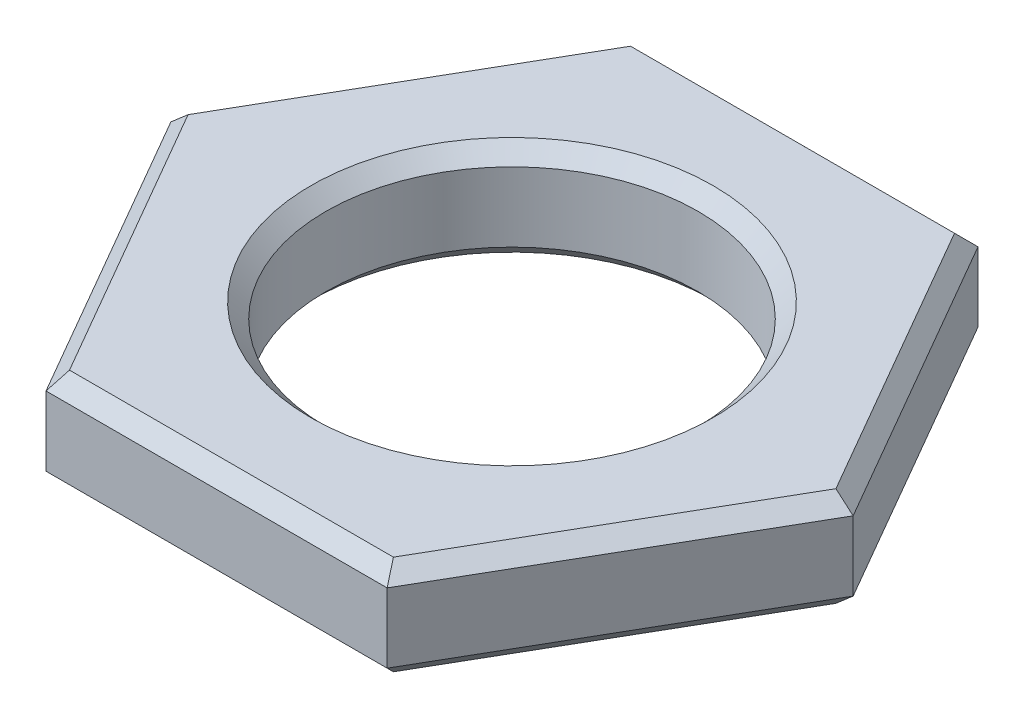
ISO-10303-21;
HEADER;
FILE_DESCRIPTION(('STEP AP214'),'2;1');
FILE_NAME('part.step','',(''),(''),'','','');
FILE_SCHEMA(('AUTOMOTIVE_DESIGN { 1 0 10303 214 1 1 1 1 }'));
ENDSEC;
DATA;
#1=APPLICATION_CONTEXT('core data for automotive mechanical design processes');
#2=APPLICATION_PROTOCOL_DEFINITION('international standard','automotive_design',2000,#1);
#3=PRODUCT_CONTEXT('',#1,'mechanical');
#4=PRODUCT('Part','Part','',(#3));
#5=PRODUCT_RELATED_PRODUCT_CATEGORY('part','',(#4));
#6=PRODUCT_DEFINITION_FORMATION('','',#4);
#7=PRODUCT_DEFINITION_CONTEXT('part definition',#1,'design');
#8=PRODUCT_DEFINITION('design','',#6,#7);
#9=PRODUCT_DEFINITION_SHAPE('','',#8);
#10=(LENGTH_UNIT() NAMED_UNIT(*) SI_UNIT(.MILLI.,.METRE.));
#11=(NAMED_UNIT(*) PLANE_ANGLE_UNIT() SI_UNIT($,.RADIAN.));
#12=(NAMED_UNIT(*) SI_UNIT($,.STERADIAN.) SOLID_ANGLE_UNIT());
#13=UNCERTAINTY_MEASURE_WITH_UNIT(LENGTH_MEASURE(1.E-05),#10,'distance_accuracy_value','');
#14=(GEOMETRIC_REPRESENTATION_CONTEXT(3) GLOBAL_UNCERTAINTY_ASSIGNED_CONTEXT((#13)) GLOBAL_UNIT_ASSIGNED_CONTEXT((#10,
#11,#12)) REPRESENTATION_CONTEXT('',''));
#15=CARTESIAN_POINT('',(0.,0.,0.));
#16=DIRECTION('',(0.,0.,1.));
#17=DIRECTION('',(1.,0.,0.));
#18=AXIS2_PLACEMENT_3D('',#15,#16,#17);
#19=CARTESIAN_POINT('',(0.,0.,0.));
#20=DIRECTION('',(0.,1.,0.));
#21=DIRECTION('',(0.,0.,1.));
#22=AXIS2_PLACEMENT_3D('',#19,#20,#21);
#23=PLANE('',#22);
#24=DIRECTION('',(0.499999999999999,0.,-0.866025403784439));
#25=VECTOR('',#24,1.);
#26=CARTESIAN_POINT('',(-6.52405804184277,0.,0.));
#27=LINE('',#26,#25);
#28=CARTESIAN_POINT('',(-6.52405804184277,0.,0.));
#29=VERTEX_POINT('',#28);
#30=CARTESIAN_POINT('',(-3.26202902092139,0.,-5.65));
#31=VERTEX_POINT('',#30);
#32=EDGE_CURVE('E221',#29,#31,#27,.T.);
#33=ORIENTED_EDGE('',*,*,#32,.T.);
#34=DIRECTION('',(1.,0.,0.));
#35=VECTOR('',#34,1.);
#36=CARTESIAN_POINT('',(3.43523410167827,0.,-5.65));
#37=LINE('',#36,#35);
#38=CARTESIAN_POINT('',(3.26202902092139,0.,-5.65));
#39=VERTEX_POINT('',#38);
#40=EDGE_CURVE('E104',#31,#39,#37,.T.);
#41=ORIENTED_EDGE('',*,*,#40,.T.);
#42=DIRECTION('',(0.5,0.,0.866025403784439));
#43=VECTOR('',#42,1.);
#44=CARTESIAN_POINT('',(3.26202902092139,0.,-5.65));
#45=LINE('',#44,#43);
#46=CARTESIAN_POINT('',(6.52405804184277,0.,0.));
#47=VERTEX_POINT('',#46);
#48=EDGE_CURVE('E106',#39,#47,#45,.T.);
#49=ORIENTED_EDGE('',*,*,#48,.T.);
#50=DIRECTION('',(-0.5,0.,0.866025403784439));
#51=VECTOR('',#50,1.);
#52=CARTESIAN_POINT('',(6.52405804184277,0.,0.));
#53=LINE('',#52,#51);
#54=CARTESIAN_POINT('',(3.26202902092139,0.,5.65));
#55=VERTEX_POINT('',#54);
#56=EDGE_CURVE('E109',#47,#55,#53,.T.);
#57=ORIENTED_EDGE('',*,*,#56,.T.);
#58=DIRECTION('',(1.,0.,0.));
#59=VECTOR('',#58,1.);
#60=CARTESIAN_POINT('',(-3.43523410167827,0.,5.65));
#61=LINE('',#60,#59);
#62=CARTESIAN_POINT('',(-3.26202902092138,0.,5.65));
#63=VERTEX_POINT('',#62);
#64=EDGE_CURVE('E213',#55,#63,#61,.F.);
#65=ORIENTED_EDGE('',*,*,#64,.T.);
#66=DIRECTION('',(-0.5,0.,-0.866025403784439));
#67=VECTOR('',#66,1.);
#68=CARTESIAN_POINT('',(-3.26202902092138,0.,5.65));
#69=LINE('',#68,#67);
#70=EDGE_CURVE('E217',#63,#29,#69,.T.);
#71=ORIENTED_EDGE('',*,*,#70,.T.);
#72=EDGE_LOOP('',(#33,#41,#49,#57,#65,#71));
#73=FACE_BOUND('',#72,.T.);
#74=CARTESIAN_POINT('',(0.,0.,0.));
#75=DIRECTION('',(0.,-1.,0.));
#76=DIRECTION('',(0.,0.,-1.));
#77=AXIS2_PLACEMENT_3D('',#74,#75,#76);
#78=CIRCLE('',#77,4.05000000000655);
#79=CARTESIAN_POINT('',(0.,0.,-4.05000000000655));
#80=VERTEX_POINT('',#79);
#81=EDGE_CURVE('E20',#80,#80,#78,.F.);
#82=ORIENTED_EDGE('',*,*,#81,.T.);
#83=EDGE_LOOP('',(#82));
#84=FACE_BOUND('',#83,.T.);
#85=ADVANCED_FACE('F17',(#73,#84),#23,.F.);
#86=CARTESIAN_POINT('',(0.,1.13686837721616E-10,0.));
#87=DIRECTION('',(0.,-1.,0.));
#88=DIRECTION('',(0.,0.,-1.));
#89=AXIS2_PLACEMENT_3D('',#86,#87,#88);
#90=CONICAL_SURFACE('',#89,4.04999999989286,0.785398163397448);
#91=CARTESIAN_POINT('',(0.,0.300000000000004,0.));
#92=DIRECTION('',(0.,-1.,0.));
#93=DIRECTION('',(0.,0.,-1.));
#94=AXIS2_PLACEMENT_3D('',#91,#92,#93);
#95=CIRCLE('',#94,3.75);
#96=CARTESIAN_POINT('',(0.,0.300000000000004,-3.75));
#97=VERTEX_POINT('',#96);
#98=EDGE_CURVE('E132',#97,#97,#95,.F.);
#99=ORIENTED_EDGE('',*,*,#98,.T.);
#100=EDGE_LOOP('',(#99));
#101=FACE_BOUND('',#100,.T.);
#102=ORIENTED_EDGE('',*,*,#81,.F.);
#103=EDGE_LOOP('',(#102));
#104=FACE_BOUND('',#103,.T.);
#105=ADVANCED_FACE('F456',(#101,#104),#90,.F.);
#106=CARTESIAN_POINT('',(3.43523410167827,0.299999999999996,5.95));
#107=DIRECTION('',(-0.612372435695792,0.70710678118655,-0.353553390593272));
#108=DIRECTION('',(-0.755928946018457,-0.654653670707974,0.));
#109=AXIS2_PLACEMENT_3D('',#106,#107,#108);
#110=PLANE('',#109);
#111=ORIENTED_EDGE('',*,*,#56,.F.);
#112=DIRECTION('',(-0.755928946018459,-0.654653670707972,0.));
#113=VECTOR('',#112,1.);
#114=CARTESIAN_POINT('',(6.87046820335655,0.299999999999996,0.));
#115=LINE('',#114,#113);
#116=CARTESIAN_POINT('',(6.87046820335655,0.299999999999996,0.));
#117=VERTEX_POINT('',#116);
#118=EDGE_CURVE('E114',#47,#117,#115,.F.);
#119=ORIENTED_EDGE('',*,*,#118,.T.);
#120=DIRECTION('',(-0.5,0.,0.866025403784439));
#121=VECTOR('',#120,1.);
#122=CARTESIAN_POINT('',(3.43523410167827,0.299999999999996,5.95));
#123=LINE('',#122,#121);
#124=CARTESIAN_POINT('',(3.43523410167827,0.299999999999996,5.95));
#125=VERTEX_POINT('',#124);
#126=EDGE_CURVE('E134',#117,#125,#123,.T.);
#127=ORIENTED_EDGE('',*,*,#126,.T.);
#128=DIRECTION('',(-0.377964473009227,-0.654653670707974,-0.654653670707981));
#129=VECTOR('',#128,1.);
#130=CARTESIAN_POINT('',(3.43523410167828,0.299999999999996,5.95));
#131=LINE('',#130,#129);
#132=EDGE_CURVE('E120',#125,#55,#131,.T.);
#133=ORIENTED_EDGE('',*,*,#132,.T.);
#134=EDGE_LOOP('',(#111,#119,#127,#133));
#135=FACE_BOUND('',#134,.T.);
#136=ADVANCED_FACE('F117',(#135),#110,.F.);
#137=CARTESIAN_POINT('',(6.87046820335655,0.299999999999996,0.));
#138=DIRECTION('',(-0.612372435695791,0.707106781186552,0.353553390593272));
#139=DIRECTION('',(-0.755928946018459,-0.654653670707972,0.));
#140=AXIS2_PLACEMENT_3D('',#137,#138,#139);
#141=PLANE('',#140);
#142=ORIENTED_EDGE('',*,*,#48,.F.);
#143=DIRECTION('',(0.377964473009229,0.654653670707973,-0.65465367070798));
#144=VECTOR('',#143,1.);
#145=CARTESIAN_POINT('',(3.26202902092139,0.,-5.65));
#146=LINE('',#145,#144);
#147=CARTESIAN_POINT('',(3.43523410167827,0.299999999999997,-5.95));
#148=VERTEX_POINT('',#147);
#149=EDGE_CURVE('E128',#39,#148,#146,.T.);
#150=ORIENTED_EDGE('',*,*,#149,.T.);
#151=DIRECTION('',(0.5,0.,0.866025403784439));
#152=VECTOR('',#151,1.);
#153=CARTESIAN_POINT('',(6.87046820335655,0.299999999999996,0.));
#154=LINE('',#153,#152);
#155=EDGE_CURVE('E125',#148,#117,#154,.T.);
#156=ORIENTED_EDGE('',*,*,#155,.T.);
#157=ORIENTED_EDGE('',*,*,#118,.F.);
#158=EDGE_LOOP('',(#142,#150,#156,#157));
#159=FACE_BOUND('',#158,.T.);
#160=ADVANCED_FACE('F123',(#159),#141,.F.);
#161=CARTESIAN_POINT('',(3.43523410167827,0.299999999999996,-5.95));
#162=DIRECTION('',(0.,0.707106781186551,0.707106781186544));
#163=DIRECTION('',(0.,-0.707106781186544,0.707106781186551));
#164=AXIS2_PLACEMENT_3D('',#161,#162,#163);
#165=PLANE('',#164);
#166=ORIENTED_EDGE('',*,*,#40,.F.);
#167=DIRECTION('',(-0.377964473009229,0.654653670707973,-0.65465367070798));
#168=VECTOR('',#167,1.);
#169=CARTESIAN_POINT('',(-3.26202902092139,0.,-5.65));
#170=LINE('',#169,#168);
#171=CARTESIAN_POINT('',(-3.43523410167828,0.299999999999997,-5.95));
#172=VERTEX_POINT('',#171);
#173=EDGE_CURVE('E219',#31,#172,#170,.T.);
#174=ORIENTED_EDGE('',*,*,#173,.T.);
#175=DIRECTION('',(1.,0.,0.));
#176=VECTOR('',#175,1.);
#177=CARTESIAN_POINT('',(3.43523410167827,0.299999999999996,-5.95));
#178=LINE('',#177,#176);
#179=EDGE_CURVE('E201',#172,#148,#178,.T.);
#180=ORIENTED_EDGE('',*,*,#179,.T.);
#181=ORIENTED_EDGE('',*,*,#149,.F.);
#182=EDGE_LOOP('',(#166,#174,#180,#181));
#183=FACE_BOUND('',#182,.T.);
#184=ADVANCED_FACE('F224',(#183),#165,.F.);
#185=CARTESIAN_POINT('',(-3.43523410167828,0.299999999999996,-5.95));
#186=DIRECTION('',(0.612372435695791,0.707106781186552,0.353553390593271));
#187=DIRECTION('',(-0.755928946018458,0.654653670707973,0.));
#188=AXIS2_PLACEMENT_3D('',#185,#186,#187);
#189=PLANE('',#188);
#190=ORIENTED_EDGE('',*,*,#32,.F.);
#191=DIRECTION('',(-0.755928946018459,0.654653670707972,0.));
#192=VECTOR('',#191,1.);
#193=CARTESIAN_POINT('',(-6.87046820335655,0.299999999999997,0.));
#194=LINE('',#193,#192);
#195=CARTESIAN_POINT('',(-6.87046820335655,0.299999999999997,0.));
#196=VERTEX_POINT('',#195);
#197=EDGE_CURVE('E215',#29,#196,#194,.T.);
#198=ORIENTED_EDGE('',*,*,#197,.T.);
#199=DIRECTION('',(0.499999999999999,0.,-0.866025403784439));
#200=VECTOR('',#199,1.);
#201=CARTESIAN_POINT('',(-3.43523410167828,0.299999999999997,-5.95));
#202=LINE('',#201,#200);
#203=EDGE_CURVE('E196',#196,#172,#202,.T.);
#204=ORIENTED_EDGE('',*,*,#203,.T.);
#205=ORIENTED_EDGE('',*,*,#173,.F.);
#206=EDGE_LOOP('',(#190,#198,#204,#205));
#207=FACE_BOUND('',#206,.T.);
#208=ADVANCED_FACE('F272',(#207),#189,.F.);
#209=CARTESIAN_POINT('',(-6.87046820335655,0.299999999999996,0.));
#210=DIRECTION('',(0.612372435695791,0.707106781186552,-0.353553390593272));
#211=DIRECTION('',(-0.755928946018459,0.654653670707972,0.));
#212=AXIS2_PLACEMENT_3D('',#209,#210,#211);
#213=PLANE('',#212);
#214=DIRECTION('',(-0.5,0.,-0.866025403784438));
#215=VECTOR('',#214,1.);
#216=CARTESIAN_POINT('',(-6.87046820335655,0.299999999999996,0.));
#217=LINE('',#216,#215);
#218=CARTESIAN_POINT('',(-3.43523410167827,0.299999999999996,5.95));
#219=VERTEX_POINT('',#218);
#220=EDGE_CURVE('E191',#219,#196,#217,.T.);
#221=ORIENTED_EDGE('',*,*,#220,.T.);
#222=ORIENTED_EDGE('',*,*,#197,.F.);
#223=ORIENTED_EDGE('',*,*,#70,.F.);
#224=DIRECTION('',(-0.377964473009228,0.654653670707973,0.654653670707981));
#225=VECTOR('',#224,1.);
#226=CARTESIAN_POINT('',(-3.26202902092138,0.,5.65));
#227=LINE('',#226,#225);
#228=EDGE_CURVE('E211',#63,#219,#227,.T.);
#229=ORIENTED_EDGE('',*,*,#228,.T.);
#230=EDGE_LOOP('',(#221,#222,#223,#229));
#231=FACE_BOUND('',#230,.T.);
#232=ADVANCED_FACE('F266',(#231),#213,.F.);
#233=CARTESIAN_POINT('',(-3.43523410167827,0.299999999999996,5.95));
#234=DIRECTION('',(0.,0.707106781186552,-0.707106781186544));
#235=DIRECTION('',(0.,0.707106781186544,0.707106781186552));
#236=AXIS2_PLACEMENT_3D('',#233,#234,#235);
#237=PLANE('',#236);
#238=DIRECTION('',(-1.,0.,0.));
#239=VECTOR('',#238,1.);
#240=CARTESIAN_POINT('',(-3.43523410167827,0.299999999999996,5.95));
#241=LINE('',#240,#239);
#242=EDGE_CURVE('E183',#125,#219,#241,.T.);
#243=ORIENTED_EDGE('',*,*,#242,.T.);
#244=ORIENTED_EDGE('',*,*,#228,.F.);
#245=ORIENTED_EDGE('',*,*,#64,.F.);
#246=ORIENTED_EDGE('',*,*,#132,.F.);
#247=EDGE_LOOP('',(#243,#244,#245,#246));
#248=FACE_BOUND('',#247,.T.);
#249=ADVANCED_FACE('F258',(#248),#237,.F.);
#250=CARTESIAN_POINT('',(0.,2.,0.));
#251=DIRECTION('',(0.,-1.,0.));
#252=DIRECTION('',(0.,0.,-1.));
#253=AXIS2_PLACEMENT_3D('',#250,#251,#252);
#254=CYLINDRICAL_SURFACE('',#253,3.75);
#255=CARTESIAN_POINT('',(0.,1.70000000002801,0.));
#256=DIRECTION('',(0.,1.,0.));
#257=DIRECTION('',(0.,0.,1.));
#258=AXIS2_PLACEMENT_3D('',#255,#256,#257);
#259=CIRCLE('',#258,3.75000000002501);
#260=CARTESIAN_POINT('',(0.,1.70000000002801,3.75000000002501));
#261=VERTEX_POINT('',#260);
#262=EDGE_CURVE('E180',#261,#261,#259,.T.);
#263=ORIENTED_EDGE('',*,*,#262,.T.);
#264=EDGE_LOOP('',(#263));
#265=FACE_BOUND('',#264,.T.);
#266=ORIENTED_EDGE('',*,*,#98,.F.);
#267=EDGE_LOOP('',(#266));
#268=FACE_BOUND('',#267,.T.);
#269=ADVANCED_FACE('F322',(#265,#268),#254,.F.);
#270=CARTESIAN_POINT('',(3.43523410167827,2.,5.95));
#271=DIRECTION('',(-0.866025403784439,0.,-0.5));
#272=DIRECTION('',(-0.5,0.,0.866025403784439));
#273=AXIS2_PLACEMENT_3D('',#270,#271,#272);
#274=PLANE('',#273);
#275=ORIENTED_EDGE('',*,*,#126,.F.);
#276=DIRECTION('',(0.,1.,0.));
#277=VECTOR('',#276,1.);
#278=CARTESIAN_POINT('',(6.87046820335655,2.,0.));
#279=LINE('',#278,#277);
#280=CARTESIAN_POINT('',(6.87046820335655,1.7,0.));
#281=VERTEX_POINT('',#280);
#282=EDGE_CURVE('E204',#117,#281,#279,.T.);
#283=ORIENTED_EDGE('',*,*,#282,.T.);
#284=DIRECTION('',(0.5,0.,-0.866025403784439));
#285=VECTOR('',#284,1.);
#286=CARTESIAN_POINT('',(3.43523410167827,1.7,5.95));
#287=LINE('',#286,#285);
#288=CARTESIAN_POINT('',(3.43523410167827,1.7,5.95));
#289=VERTEX_POINT('',#288);
#290=EDGE_CURVE('E177',#289,#281,#287,.T.);
#291=ORIENTED_EDGE('',*,*,#290,.F.);
#292=DIRECTION('',(0.,1.,0.));
#293=VECTOR('',#292,1.);
#294=CARTESIAN_POINT('',(3.43523410167827,2.,5.95));
#295=LINE('',#294,#293);
#296=EDGE_CURVE('E186',#289,#125,#295,.F.);
#297=ORIENTED_EDGE('',*,*,#296,.T.);
#298=EDGE_LOOP('',(#275,#283,#291,#297));
#299=FACE_BOUND('',#298,.T.);
#300=ADVANCED_FACE('F249',(#299),#274,.F.);
#301=CARTESIAN_POINT('',(6.87046820335655,2.,0.));
#302=DIRECTION('',(-0.866025403784439,0.,0.5));
#303=DIRECTION('',(0.5,0.,0.866025403784439));
#304=AXIS2_PLACEMENT_3D('',#301,#302,#303);
#305=PLANE('',#304);
#306=ORIENTED_EDGE('',*,*,#155,.F.);
#307=DIRECTION('',(0.,1.,0.));
#308=VECTOR('',#307,1.);
#309=CARTESIAN_POINT('',(3.43523410167827,2.,-5.95));
#310=LINE('',#309,#308);
#311=CARTESIAN_POINT('',(3.43523410167827,1.7,-5.95));
#312=VERTEX_POINT('',#311);
#313=EDGE_CURVE('E199',#148,#312,#310,.T.);
#314=ORIENTED_EDGE('',*,*,#313,.T.);
#315=DIRECTION('',(-0.5,0.,-0.866025403784439));
#316=VECTOR('',#315,1.);
#317=CARTESIAN_POINT('',(6.87046820335655,1.7,0.));
#318=LINE('',#317,#316);
#319=EDGE_CURVE('E171',#281,#312,#318,.T.);
#320=ORIENTED_EDGE('',*,*,#319,.F.);
#321=ORIENTED_EDGE('',*,*,#282,.F.);
#322=EDGE_LOOP('',(#306,#314,#320,#321));
#323=FACE_BOUND('',#322,.T.);
#324=ADVANCED_FACE('F231',(#323),#305,.F.);
#325=CARTESIAN_POINT('',(3.43523410167827,2.,-5.95));
#326=DIRECTION('',(0.,0.,1.));
#327=DIRECTION('',(1.,0.,0.));
#328=AXIS2_PLACEMENT_3D('',#325,#326,#327);
#329=PLANE('',#328);
#330=ORIENTED_EDGE('',*,*,#179,.F.);
#331=DIRECTION('',(0.,1.,0.));
#332=VECTOR('',#331,1.);
#333=CARTESIAN_POINT('',(-3.43523410167828,2.,-5.95));
#334=LINE('',#333,#332);
#335=CARTESIAN_POINT('',(-3.43523410167828,1.7,-5.95));
#336=VERTEX_POINT('',#335);
#337=EDGE_CURVE('E194',#172,#336,#334,.T.);
#338=ORIENTED_EDGE('',*,*,#337,.T.);
#339=DIRECTION('',(1.,0.,0.));
#340=VECTOR('',#339,1.);
#341=CARTESIAN_POINT('',(0.,1.7,-5.95));
#342=LINE('',#341,#340);
#343=EDGE_CURVE('E165',#312,#336,#342,.F.);
#344=ORIENTED_EDGE('',*,*,#343,.F.);
#345=ORIENTED_EDGE('',*,*,#313,.F.);
#346=EDGE_LOOP('',(#330,#338,#344,#345));
#347=FACE_BOUND('',#346,.T.);
#348=ADVANCED_FACE('F234',(#347),#329,.F.);
#349=CARTESIAN_POINT('',(-3.43523410167828,2.,-5.95));
#350=DIRECTION('',(0.866025403784439,0.,0.499999999999999));
#351=DIRECTION('',(0.499999999999999,0.,-0.866025403784439));
#352=AXIS2_PLACEMENT_3D('',#349,#350,#351);
#353=PLANE('',#352);
#354=ORIENTED_EDGE('',*,*,#203,.F.);
#355=DIRECTION('',(0.,1.,0.));
#356=VECTOR('',#355,1.);
#357=CARTESIAN_POINT('',(-6.87046820335655,2.,0.));
#358=LINE('',#357,#356);
#359=CARTESIAN_POINT('',(-6.87046820335655,1.7,0.));
#360=VERTEX_POINT('',#359);
#361=EDGE_CURVE('E189',#196,#360,#358,.T.);
#362=ORIENTED_EDGE('',*,*,#361,.T.);
#363=DIRECTION('',(-0.5,0.,0.866025403784439));
#364=VECTOR('',#363,1.);
#365=CARTESIAN_POINT('',(-3.43523410167828,1.7,-5.95));
#366=LINE('',#365,#364);
#367=EDGE_CURVE('E159',#336,#360,#366,.T.);
#368=ORIENTED_EDGE('',*,*,#367,.F.);
#369=ORIENTED_EDGE('',*,*,#337,.F.);
#370=EDGE_LOOP('',(#354,#362,#368,#369));
#371=FACE_BOUND('',#370,.T.);
#372=ADVANCED_FACE('F269',(#371),#353,.F.);
#373=CARTESIAN_POINT('',(-6.87046820335655,2.,0.));
#374=DIRECTION('',(0.866025403784438,0.,-0.5));
#375=DIRECTION('',(-0.5,0.,-0.866025403784438));
#376=AXIS2_PLACEMENT_3D('',#373,#374,#375);
#377=PLANE('',#376);
#378=ORIENTED_EDGE('',*,*,#220,.F.);
#379=DIRECTION('',(0.,1.,0.));
#380=VECTOR('',#379,1.);
#381=CARTESIAN_POINT('',(-3.43523410167827,2.,5.95));
#382=LINE('',#381,#380);
#383=CARTESIAN_POINT('',(-3.43523410167827,1.7,5.95));
#384=VERTEX_POINT('',#383);
#385=EDGE_CURVE('E181',#219,#384,#382,.T.);
#386=ORIENTED_EDGE('',*,*,#385,.T.);
#387=DIRECTION('',(0.5,0.,0.866025403784438));
#388=VECTOR('',#387,1.);
#389=CARTESIAN_POINT('',(-6.87046820335655,1.7,0.));
#390=LINE('',#389,#388);
#391=EDGE_CURVE('E154',#360,#384,#390,.T.);
#392=ORIENTED_EDGE('',*,*,#391,.F.);
#393=ORIENTED_EDGE('',*,*,#361,.F.);
#394=EDGE_LOOP('',(#378,#386,#392,#393));
#395=FACE_BOUND('',#394,.T.);
#396=ADVANCED_FACE('F261',(#395),#377,.F.);
#397=CARTESIAN_POINT('',(-3.43523410167827,2.,5.95));
#398=DIRECTION('',(0.,0.,-1.));
#399=DIRECTION('',(-1.,0.,0.));
#400=AXIS2_PLACEMENT_3D('',#397,#398,#399);
#401=PLANE('',#400);
#402=ORIENTED_EDGE('',*,*,#242,.F.);
#403=ORIENTED_EDGE('',*,*,#296,.F.);
#404=DIRECTION('',(1.,0.,0.));
#405=VECTOR('',#404,1.);
#406=CARTESIAN_POINT('',(0.,1.7,5.95));
#407=LINE('',#406,#405);
#408=EDGE_CURVE('E145',#384,#289,#407,.T.);
#409=ORIENTED_EDGE('',*,*,#408,.F.);
#410=ORIENTED_EDGE('',*,*,#385,.F.);
#411=EDGE_LOOP('',(#402,#403,#409,#410));
#412=FACE_BOUND('',#411,.T.);
#413=ADVANCED_FACE('F253',(#412),#401,.F.);
#414=CARTESIAN_POINT('',(0.,2.00000000006639,0.));
#415=DIRECTION('',(0.,1.,0.));
#416=DIRECTION('',(0.,0.,1.));
#417=AXIS2_PLACEMENT_3D('',#414,#415,#416);
#418=CONICAL_SURFACE('',#417,4.05000000006339,0.785398163397448);
#419=ORIENTED_EDGE('',*,*,#262,.F.);
#420=EDGE_LOOP('',(#419));
#421=FACE_BOUND('',#420,.T.);
#422=CARTESIAN_POINT('',(0.,2.00000000000955,0.));
#423=DIRECTION('',(0.,1.,0.));
#424=DIRECTION('',(0.,0.,1.));
#425=AXIS2_PLACEMENT_3D('',#422,#423,#424);
#426=CIRCLE('',#425,4.05000000000655);
#427=CARTESIAN_POINT('',(0.,2.00000000000955,4.05000000000655));
#428=VERTEX_POINT('',#427);
#429=EDGE_CURVE('E135',#428,#428,#426,.F.);
#430=ORIENTED_EDGE('',*,*,#429,.F.);
#431=EDGE_LOOP('',(#430));
#432=FACE_BOUND('',#431,.T.);
#433=ADVANCED_FACE('F306',(#421,#432),#418,.F.);
#434=CARTESIAN_POINT('',(4.89304353138208,2.,2.825));
#435=DIRECTION('',(0.612372435695797,0.707106781186544,0.353553390593275));
#436=DIRECTION('',(-0.755928946018451,0.654653670707981,0.));
#437=AXIS2_PLACEMENT_3D('',#434,#435,#436);
#438=PLANE('',#437);
#439=DIRECTION('',(-0.755928946018453,0.654653670707978,0.));
#440=VECTOR('',#439,1.);
#441=CARTESIAN_POINT('',(5.59204975015095,2.80714285714286,0.));
#442=LINE('',#441,#440);
#443=CARTESIAN_POINT('',(6.52405804184277,2.,0.));
#444=VERTEX_POINT('',#443);
#445=EDGE_CURVE('E174',#444,#281,#442,.F.);
#446=ORIENTED_EDGE('',*,*,#445,.F.);
#447=DIRECTION('',(0.5,0.,-0.866025403784439));
#448=VECTOR('',#447,1.);
#449=CARTESIAN_POINT('',(3.26202902092139,2.,5.65));
#450=LINE('',#449,#448);
#451=CARTESIAN_POINT('',(3.26202902092138,2.,5.65));
#452=VERTEX_POINT('',#451);
#453=EDGE_CURVE('E137',#452,#444,#450,.T.);
#454=ORIENTED_EDGE('',*,*,#453,.F.);
#455=DIRECTION('',(-0.377964473009225,0.65465367070798,-0.654653670707976));
#456=VECTOR('',#455,1.);
#457=CARTESIAN_POINT('',(3.43523410167827,1.7,5.95));
#458=LINE('',#457,#456);
#459=EDGE_CURVE('E138',#289,#452,#458,.T.);
#460=ORIENTED_EDGE('',*,*,#459,.F.);
#461=ORIENTED_EDGE('',*,*,#290,.T.);
#462=EDGE_LOOP('',(#446,#454,#460,#461));
#463=FACE_BOUND('',#462,.T.);
#464=ADVANCED_FACE('F246',(#463),#438,.T.);
#465=CARTESIAN_POINT('',(4.89304353138208,2.,-2.825));
#466=DIRECTION('',(0.612372435695796,0.707106781186546,-0.353553390593274));
#467=DIRECTION('',(-0.755928946018453,0.654653670707978,0.));
#468=AXIS2_PLACEMENT_3D('',#465,#466,#467);
#469=PLANE('',#468);
#470=DIRECTION('',(0.377964473009226,-0.654653670707979,-0.654653670707976));
#471=VECTOR('',#470,1.);
#472=CARTESIAN_POINT('',(3.26202902092138,2.,-5.65));
#473=LINE('',#472,#471);
#474=CARTESIAN_POINT('',(3.26202902092138,2.,-5.65));
#475=VERTEX_POINT('',#474);
#476=EDGE_CURVE('E168',#475,#312,#473,.T.);
#477=ORIENTED_EDGE('',*,*,#476,.F.);
#478=DIRECTION('',(-0.5,0.,-0.866025403784439));
#479=VECTOR('',#478,1.);
#480=CARTESIAN_POINT('',(6.52405804184277,2.,0.));
#481=LINE('',#480,#479);
#482=EDGE_CURVE('E142',#444,#475,#481,.T.);
#483=ORIENTED_EDGE('',*,*,#482,.F.);
#484=ORIENTED_EDGE('',*,*,#445,.T.);
#485=ORIENTED_EDGE('',*,*,#319,.T.);
#486=EDGE_LOOP('',(#477,#483,#484,#485));
#487=FACE_BOUND('',#486,.T.);
#488=ADVANCED_FACE('F244',(#487),#469,.T.);
#489=CARTESIAN_POINT('',(0.,2.,-5.65));
#490=DIRECTION('',(0.,0.707106781186545,-0.70710678118655));
#491=DIRECTION('',(0.,0.70710678118655,0.707106781186545));
#492=AXIS2_PLACEMENT_3D('',#489,#490,#491);
#493=PLANE('',#492);
#494=ORIENTED_EDGE('',*,*,#476,.T.);
#495=ORIENTED_EDGE('',*,*,#343,.T.);
#496=DIRECTION('',(-0.377964473009226,-0.65465367070798,-0.654653670707975));
#497=VECTOR('',#496,1.);
#498=CARTESIAN_POINT('',(-3.26202902092139,2.,-5.65));
#499=LINE('',#498,#497);
#500=CARTESIAN_POINT('',(-3.26202902092139,2.,-5.65));
#501=VERTEX_POINT('',#500);
#502=EDGE_CURVE('E162',#501,#336,#499,.T.);
#503=ORIENTED_EDGE('',*,*,#502,.F.);
#504=DIRECTION('',(1.,0.,0.));
#505=VECTOR('',#504,1.);
#506=CARTESIAN_POINT('',(0.,2.,-5.65));
#507=LINE('',#506,#505);
#508=EDGE_CURVE('E240',#475,#501,#507,.F.);
#509=ORIENTED_EDGE('',*,*,#508,.F.);
#510=EDGE_LOOP('',(#494,#495,#503,#509));
#511=FACE_BOUND('',#510,.T.);
#512=ADVANCED_FACE('F238',(#511),#493,.T.);
#513=CARTESIAN_POINT('',(-4.89304353138208,2.,-2.825));
#514=DIRECTION('',(-0.612372435695796,0.707106781186546,-0.353553390593274));
#515=DIRECTION('',(-0.755928946018453,-0.654653670707979,0.));
#516=AXIS2_PLACEMENT_3D('',#513,#514,#515);
#517=PLANE('',#516);
#518=ORIENTED_EDGE('',*,*,#502,.T.);
#519=ORIENTED_EDGE('',*,*,#367,.T.);
#520=DIRECTION('',(-0.755928946018452,-0.65465367070798,0.));
#521=VECTOR('',#520,1.);
#522=CARTESIAN_POINT('',(-5.59204975015095,2.80714285714286,0.));
#523=LINE('',#522,#521);
#524=CARTESIAN_POINT('',(-6.52405804184277,2.,0.));
#525=VERTEX_POINT('',#524);
#526=EDGE_CURVE('E156',#525,#360,#523,.T.);
#527=ORIENTED_EDGE('',*,*,#526,.F.);
#528=DIRECTION('',(-0.5,0.,0.866025403784439));
#529=VECTOR('',#528,1.);
#530=CARTESIAN_POINT('',(-3.26202902092139,2.,-5.65));
#531=LINE('',#530,#529);
#532=EDGE_CURVE('E485',#501,#525,#531,.T.);
#533=ORIENTED_EDGE('',*,*,#532,.F.);
#534=EDGE_LOOP('',(#518,#519,#527,#533));
#535=FACE_BOUND('',#534,.T.);
#536=ADVANCED_FACE('F296',(#535),#517,.T.);
#537=CARTESIAN_POINT('',(-4.89304353138208,2.,2.825));
#538=DIRECTION('',(-0.612372435695797,0.707106781186545,0.353553390593275));
#539=DIRECTION('',(-0.755928946018452,-0.65465367070798,0.));
#540=AXIS2_PLACEMENT_3D('',#537,#538,#539);
#541=PLANE('',#540);
#542=DIRECTION('',(-0.377964473009225,-0.65465367070798,0.654653670707976));
#543=VECTOR('',#542,1.);
#544=CARTESIAN_POINT('',(-3.26202902092138,2.,5.65));
#545=LINE('',#544,#543);
#546=CARTESIAN_POINT('',(-3.26202902092138,2.,5.65));
#547=VERTEX_POINT('',#546);
#548=EDGE_CURVE('E35',#547,#384,#545,.T.);
#549=ORIENTED_EDGE('',*,*,#548,.F.);
#550=DIRECTION('',(0.5,0.,0.866025403784439));
#551=VECTOR('',#550,1.);
#552=CARTESIAN_POINT('',(-6.52405804184277,2.,0.));
#553=LINE('',#552,#551);
#554=EDGE_CURVE('E26',#525,#547,#553,.T.);
#555=ORIENTED_EDGE('',*,*,#554,.F.);
#556=ORIENTED_EDGE('',*,*,#526,.T.);
#557=ORIENTED_EDGE('',*,*,#391,.T.);
#558=EDGE_LOOP('',(#549,#555,#556,#557));
#559=FACE_BOUND('',#558,.T.);
#560=ADVANCED_FACE('F290',(#559),#541,.T.);
#561=CARTESIAN_POINT('',(0.,2.,5.65));
#562=DIRECTION('',(0.,0.707106781186545,0.70710678118655));
#563=DIRECTION('',(0.,-0.70710678118655,0.707106781186545));
#564=AXIS2_PLACEMENT_3D('',#561,#562,#563);
#565=PLANE('',#564);
#566=ORIENTED_EDGE('',*,*,#459,.T.);
#567=DIRECTION('',(1.,0.,0.));
#568=VECTOR('',#567,1.);
#569=CARTESIAN_POINT('',(0.,2.,5.65));
#570=LINE('',#569,#568);
#571=EDGE_CURVE('E11',#547,#452,#570,.T.);
#572=ORIENTED_EDGE('',*,*,#571,.F.);
#573=ORIENTED_EDGE('',*,*,#548,.T.);
#574=ORIENTED_EDGE('',*,*,#408,.T.);
#575=EDGE_LOOP('',(#566,#572,#573,#574));
#576=FACE_BOUND('',#575,.T.);
#577=ADVANCED_FACE('F284',(#576),#565,.T.);
#578=CARTESIAN_POINT('',(0.,2.,0.));
#579=DIRECTION('',(0.,1.,0.));
#580=DIRECTION('',(0.,0.,1.));
#581=AXIS2_PLACEMENT_3D('',#578,#579,#580);
#582=PLANE('',#581);
#583=ORIENTED_EDGE('',*,*,#554,.T.);
#584=ORIENTED_EDGE('',*,*,#571,.T.);
#585=ORIENTED_EDGE('',*,*,#453,.T.);
#586=ORIENTED_EDGE('',*,*,#482,.T.);
#587=ORIENTED_EDGE('',*,*,#508,.T.);
#588=ORIENTED_EDGE('',*,*,#532,.T.);
#589=EDGE_LOOP('',(#583,#584,#585,#586,#587,#588));
#590=FACE_BOUND('',#589,.T.);
#591=ORIENTED_EDGE('',*,*,#429,.T.);
#592=EDGE_LOOP('',(#591));
#593=FACE_BOUND('',#592,.T.);
#594=ADVANCED_FACE('F282',(#590,#593),#582,.T.);
#595=CLOSED_SHELL('',(#85,#105,#136,#160,#184,#208,#232,#249,#269,#300,#324,#348,#372,#396,#413,
#433,#464,#488,#512,#536,#560,#577,#594));
#596=MANIFOLD_SOLID_BREP('B1',#595);
#597=ADVANCED_BREP_SHAPE_REPRESENTATION('',(#18,#596),#14);
#598=SHAPE_DEFINITION_REPRESENTATION(#9,#597);
ENDSEC;
END-ISO-10303-21;
